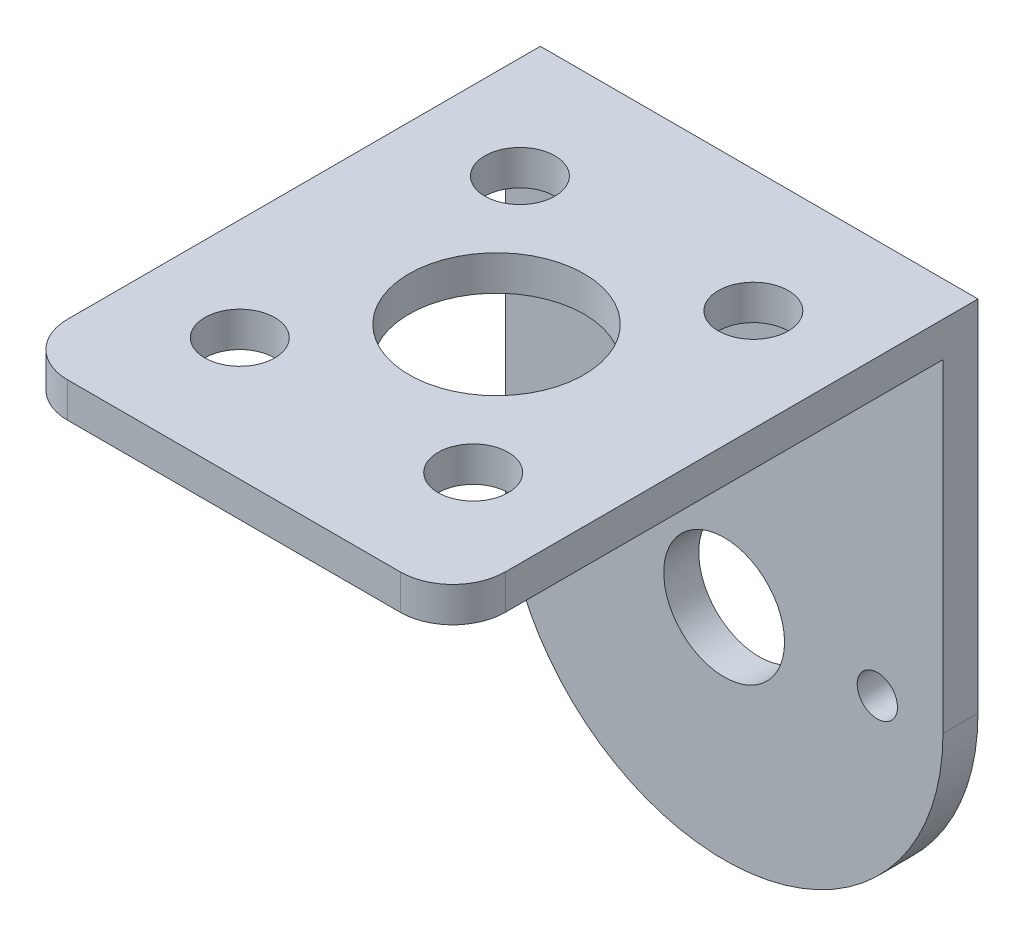
ISO-10303-21;
HEADER;
FILE_DESCRIPTION(('STEP AP214'),'2;1');
FILE_NAME('part.step','',(''),(''),'','','');
FILE_SCHEMA(('AUTOMOTIVE_DESIGN { 1 0 10303 214 1 1 1 1 }'));
ENDSEC;
DATA;
#1=APPLICATION_CONTEXT('core data for automotive mechanical design processes');
#2=APPLICATION_PROTOCOL_DEFINITION('international standard','automotive_design',2000,#1);
#3=PRODUCT_CONTEXT('',#1,'mechanical');
#4=PRODUCT('Part','Part','',(#3));
#5=PRODUCT_RELATED_PRODUCT_CATEGORY('part','',(#4));
#6=PRODUCT_DEFINITION_FORMATION('','',#4);
#7=PRODUCT_DEFINITION_CONTEXT('part definition',#1,'design');
#8=PRODUCT_DEFINITION('design','',#6,#7);
#9=PRODUCT_DEFINITION_SHAPE('','',#8);
#10=(LENGTH_UNIT() NAMED_UNIT(*) SI_UNIT(.MILLI.,.METRE.));
#11=(NAMED_UNIT(*) PLANE_ANGLE_UNIT() SI_UNIT($,.RADIAN.));
#12=(NAMED_UNIT(*) SI_UNIT($,.STERADIAN.) SOLID_ANGLE_UNIT());
#13=UNCERTAINTY_MEASURE_WITH_UNIT(LENGTH_MEASURE(1.E-05),#10,'distance_accuracy_value','');
#14=(GEOMETRIC_REPRESENTATION_CONTEXT(3) GLOBAL_UNCERTAINTY_ASSIGNED_CONTEXT((#13)) GLOBAL_UNIT_ASSIGNED_CONTEXT((#10,
#11,#12)) REPRESENTATION_CONTEXT('',''));
#15=CARTESIAN_POINT('',(0.,0.,0.));
#16=DIRECTION('',(0.,0.,1.));
#17=DIRECTION('',(1.,0.,0.));
#18=AXIS2_PLACEMENT_3D('',#15,#16,#17);
#19=CARTESIAN_POINT('',(-0.0431010072717737,-4.,2.));
#20=DIRECTION('',(0.,0.,1.));
#21=DIRECTION('',(1.,0.,0.));
#22=AXIS2_PLACEMENT_3D('',#19,#20,#21);
#23=PLANE('',#22);
#24=DIRECTION('',(1.,0.,0.));
#25=VECTOR('',#24,1.);
#26=CARTESIAN_POINT('',(-12.5431010072718,14.5,2.));
#27=LINE('',#26,#25);
#28=CARTESIAN_POINT('',(-12.5431010072718,14.5,2.));
#29=VERTEX_POINT('',#28);
#30=CARTESIAN_POINT('',(12.4568989927282,14.5,2.));
#31=VERTEX_POINT('',#30);
#32=EDGE_CURVE('E112',#29,#31,#27,.T.);
#33=ORIENTED_EDGE('',*,*,#32,.F.);
#34=DIRECTION('',(0.,-1.,0.));
#35=VECTOR('',#34,1.);
#36=CARTESIAN_POINT('',(-12.5431010072718,-4.,2.));
#37=LINE('',#36,#35);
#38=CARTESIAN_POINT('',(-12.5431010072718,-4.,2.));
#39=VERTEX_POINT('',#38);
#40=EDGE_CURVE('E150',#29,#39,#37,.T.);
#41=ORIENTED_EDGE('',*,*,#40,.T.);
#42=CARTESIAN_POINT('',(-0.0431010072717737,-4.,2.));
#43=DIRECTION('',(0.,0.,1.));
#44=DIRECTION('',(1.,0.,0.));
#45=AXIS2_PLACEMENT_3D('',#42,#43,#44);
#46=CIRCLE('',#45,12.5);
#47=CARTESIAN_POINT('',(12.4568989927282,-4.,2.));
#48=VERTEX_POINT('',#47);
#49=EDGE_CURVE('E115',#39,#48,#46,.T.);
#50=ORIENTED_EDGE('',*,*,#49,.T.);
#51=DIRECTION('',(0.,1.,0.));
#52=VECTOR('',#51,1.);
#53=CARTESIAN_POINT('',(12.4568989927282,-4.,2.));
#54=LINE('',#53,#52);
#55=EDGE_CURVE('E100',#48,#31,#54,.T.);
#56=ORIENTED_EDGE('',*,*,#55,.T.);
#57=EDGE_LOOP('',(#33,#41,#50,#56));
#58=FACE_BOUND('',#57,.T.);
#59=CARTESIAN_POINT('',(8.70689899272823,-4.,2.));
#60=DIRECTION('',(0.,0.,1.));
#61=DIRECTION('',(1.,0.,0.));
#62=AXIS2_PLACEMENT_3D('',#59,#60,#61);
#63=CIRCLE('',#62,1.15);
#64=CARTESIAN_POINT('',(9.85689899272823,-4.,2.));
#65=VERTEX_POINT('',#64);
#66=EDGE_CURVE('E138',#65,#65,#63,.T.);
#67=ORIENTED_EDGE('',*,*,#66,.F.);
#68=EDGE_LOOP('',(#67));
#69=FACE_BOUND('',#68,.T.);
#70=CARTESIAN_POINT('',(-0.0431010072717737,-4.,2.));
#71=DIRECTION('',(0.,0.,1.));
#72=DIRECTION('',(1.,0.,0.));
#73=AXIS2_PLACEMENT_3D('',#70,#71,#72);
#74=CIRCLE('',#73,3.45);
#75=CARTESIAN_POINT('',(3.40689899272823,-4.,2.));
#76=VERTEX_POINT('',#75);
#77=EDGE_CURVE('E144',#76,#76,#74,.T.);
#78=ORIENTED_EDGE('',*,*,#77,.F.);
#79=EDGE_LOOP('',(#78));
#80=FACE_BOUND('',#79,.T.);
#81=CARTESIAN_POINT('',(-8.79310100727177,-4.,2.));
#82=DIRECTION('',(0.,0.,1.));
#83=DIRECTION('',(1.,0.,0.));
#84=AXIS2_PLACEMENT_3D('',#81,#82,#83);
#85=CIRCLE('',#84,1.15);
#86=CARTESIAN_POINT('',(-7.64310100727177,-4.,2.));
#87=VERTEX_POINT('',#86);
#88=EDGE_CURVE('E132',#87,#87,#85,.T.);
#89=ORIENTED_EDGE('',*,*,#88,.F.);
#90=EDGE_LOOP('',(#89));
#91=FACE_BOUND('',#90,.T.);
#92=ADVANCED_FACE('F32',(#58,#69,#80,#91),#23,.T.);
#93=CARTESIAN_POINT('',(-0.0431010072717737,-4.,0.));
#94=DIRECTION('',(0.,0.,1.));
#95=DIRECTION('',(1.,0.,0.));
#96=AXIS2_PLACEMENT_3D('',#93,#94,#95);
#97=PLANE('',#96);
#98=DIRECTION('',(0.,-1.,0.));
#99=VECTOR('',#98,1.);
#100=CARTESIAN_POINT('',(-12.5431010072718,-4.,0.));
#101=LINE('',#100,#99);
#102=CARTESIAN_POINT('',(-12.5431010072718,16.5,0.));
#103=VERTEX_POINT('',#102);
#104=CARTESIAN_POINT('',(-12.5431010072718,-4.,0.));
#105=VERTEX_POINT('',#104);
#106=EDGE_CURVE('E147',#103,#105,#101,.T.);
#107=ORIENTED_EDGE('',*,*,#106,.F.);
#108=DIRECTION('',(-1.,0.,0.));
#109=VECTOR('',#108,1.);
#110=CARTESIAN_POINT('',(12.4568989927282,16.5,0.));
#111=LINE('',#110,#109);
#112=CARTESIAN_POINT('',(12.4568989927282,16.5,0.));
#113=VERTEX_POINT('',#112);
#114=EDGE_CURVE('E152',#113,#103,#111,.T.);
#115=ORIENTED_EDGE('',*,*,#114,.F.);
#116=DIRECTION('',(0.,1.,0.));
#117=VECTOR('',#116,1.);
#118=CARTESIAN_POINT('',(12.4568989927282,-4.,0.));
#119=LINE('',#118,#117);
#120=CARTESIAN_POINT('',(12.4568989927282,-4.,0.));
#121=VERTEX_POINT('',#120);
#122=EDGE_CURVE('E158',#121,#113,#119,.T.);
#123=ORIENTED_EDGE('',*,*,#122,.F.);
#124=CARTESIAN_POINT('',(-0.0431010072717737,-4.,0.));
#125=DIRECTION('',(0.,0.,1.));
#126=DIRECTION('',(1.,0.,0.));
#127=AXIS2_PLACEMENT_3D('',#124,#125,#126);
#128=CIRCLE('',#127,12.5);
#129=EDGE_CURVE('E156',#105,#121,#128,.T.);
#130=ORIENTED_EDGE('',*,*,#129,.F.);
#131=EDGE_LOOP('',(#107,#115,#123,#130));
#132=FACE_BOUND('',#131,.T.);
#133=CARTESIAN_POINT('',(-0.0431010072717737,-4.,0.));
#134=DIRECTION('',(0.,0.,1.));
#135=DIRECTION('',(1.,0.,0.));
#136=AXIS2_PLACEMENT_3D('',#133,#134,#135);
#137=CIRCLE('',#136,3.45);
#138=CARTESIAN_POINT('',(3.40689899272823,-4.,0.));
#139=VERTEX_POINT('',#138);
#140=EDGE_CURVE('E141',#139,#139,#137,.T.);
#141=ORIENTED_EDGE('',*,*,#140,.T.);
#142=EDGE_LOOP('',(#141));
#143=FACE_BOUND('',#142,.T.);
#144=CARTESIAN_POINT('',(8.70689899272823,-4.,0.));
#145=DIRECTION('',(0.,0.,1.));
#146=DIRECTION('',(1.,0.,0.));
#147=AXIS2_PLACEMENT_3D('',#144,#145,#146);
#148=CIRCLE('',#147,1.15);
#149=CARTESIAN_POINT('',(9.85689899272823,-4.,0.));
#150=VERTEX_POINT('',#149);
#151=EDGE_CURVE('E135',#150,#150,#148,.T.);
#152=ORIENTED_EDGE('',*,*,#151,.T.);
#153=EDGE_LOOP('',(#152));
#154=FACE_BOUND('',#153,.T.);
#155=CARTESIAN_POINT('',(-8.79310100727177,-4.,0.));
#156=DIRECTION('',(0.,0.,1.));
#157=DIRECTION('',(1.,0.,0.));
#158=AXIS2_PLACEMENT_3D('',#155,#156,#157);
#159=CIRCLE('',#158,1.15);
#160=CARTESIAN_POINT('',(-7.64310100727177,-4.,0.));
#161=VERTEX_POINT('',#160);
#162=EDGE_CURVE('E131',#161,#161,#159,.T.);
#163=ORIENTED_EDGE('',*,*,#162,.T.);
#164=EDGE_LOOP('',(#163));
#165=FACE_BOUND('',#164,.T.);
#166=ADVANCED_FACE('F199',(#132,#143,#154,#165),#97,.F.);
#167=CARTESIAN_POINT('',(-12.5431010072718,-4.,2.));
#168=DIRECTION('',(1.,0.,0.));
#169=DIRECTION('',(0.,0.,-1.));
#170=AXIS2_PLACEMENT_3D('',#167,#168,#169);
#171=PLANE('',#170);
#172=DIRECTION('',(0.,0.,-1.));
#173=VECTOR('',#172,1.);
#174=CARTESIAN_POINT('',(-12.5431010072718,14.5,30.));
#175=LINE('',#174,#173);
#176=CARTESIAN_POINT('',(-12.5431010072718,14.5,27.));
#177=VERTEX_POINT('',#176);
#178=EDGE_CURVE('E106',#177,#29,#175,.T.);
#179=ORIENTED_EDGE('',*,*,#178,.F.);
#180=DIRECTION('',(0.,-1.,0.));
#181=VECTOR('',#180,1.);
#182=CARTESIAN_POINT('',(-12.5431010072718,16.5,27.));
#183=LINE('',#182,#181);
#184=CARTESIAN_POINT('',(-12.5431010072718,16.5,27.));
#185=VERTEX_POINT('',#184);
#186=EDGE_CURVE('E40',#177,#185,#183,.F.);
#187=ORIENTED_EDGE('',*,*,#186,.T.);
#188=DIRECTION('',(0.,0.,-1.));
#189=VECTOR('',#188,1.);
#190=CARTESIAN_POINT('',(-12.5431010072718,16.5,2.));
#191=LINE('',#190,#189);
#192=EDGE_CURVE('E117',#185,#103,#191,.T.);
#193=ORIENTED_EDGE('',*,*,#192,.T.);
#194=ORIENTED_EDGE('',*,*,#106,.T.);
#195=DIRECTION('',(0.,0.,-1.));
#196=VECTOR('',#195,1.);
#197=CARTESIAN_POINT('',(-12.5431010072718,-4.,2.));
#198=LINE('',#197,#196);
#199=EDGE_CURVE('E168',#39,#105,#198,.T.);
#200=ORIENTED_EDGE('',*,*,#199,.F.);
#201=ORIENTED_EDGE('',*,*,#40,.F.);
#202=EDGE_LOOP('',(#179,#187,#193,#194,#200,#201));
#203=FACE_BOUND('',#202,.T.);
#204=ADVANCED_FACE('F204',(#203),#171,.F.);
#205=CARTESIAN_POINT('',(-0.0431010072717737,-4.,2.));
#206=DIRECTION('',(0.,0.,-1.));
#207=DIRECTION('',(-1.,0.,0.));
#208=AXIS2_PLACEMENT_3D('',#205,#206,#207);
#209=CYLINDRICAL_SURFACE('',#208,12.5);
#210=ORIENTED_EDGE('',*,*,#129,.T.);
#211=DIRECTION('',(0.,0.,-1.));
#212=VECTOR('',#211,1.);
#213=CARTESIAN_POINT('',(12.4568989927282,-4.,2.));
#214=LINE('',#213,#212);
#215=EDGE_CURVE('E166',#48,#121,#214,.T.);
#216=ORIENTED_EDGE('',*,*,#215,.F.);
#217=ORIENTED_EDGE('',*,*,#49,.F.);
#218=ORIENTED_EDGE('',*,*,#199,.T.);
#219=EDGE_LOOP('',(#210,#216,#217,#218));
#220=FACE_BOUND('',#219,.T.);
#221=ADVANCED_FACE('F216',(#220),#209,.T.);
#222=CARTESIAN_POINT('',(12.4568989927282,-4.,2.));
#223=DIRECTION('',(-1.,0.,0.));
#224=DIRECTION('',(0.,0.,1.));
#225=AXIS2_PLACEMENT_3D('',#222,#223,#224);
#226=PLANE('',#225);
#227=DIRECTION('',(0.,0.,-1.));
#228=VECTOR('',#227,1.);
#229=CARTESIAN_POINT('',(12.4568989927282,16.5,2.));
#230=LINE('',#229,#228);
#231=CARTESIAN_POINT('',(12.4568989927282,16.5,27.));
#232=VERTEX_POINT('',#231);
#233=EDGE_CURVE('E164',#232,#113,#230,.T.);
#234=ORIENTED_EDGE('',*,*,#233,.F.);
#235=DIRECTION('',(0.,1.,0.));
#236=VECTOR('',#235,1.);
#237=CARTESIAN_POINT('',(12.4568989927282,14.5,27.));
#238=LINE('',#237,#236);
#239=CARTESIAN_POINT('',(12.4568989927282,14.5,27.));
#240=VERTEX_POINT('',#239);
#241=EDGE_CURVE('E102',#232,#240,#238,.F.);
#242=ORIENTED_EDGE('',*,*,#241,.T.);
#243=DIRECTION('',(0.,0.,-1.));
#244=VECTOR('',#243,1.);
#245=CARTESIAN_POINT('',(12.4568989927282,14.5,30.));
#246=LINE('',#245,#244);
#247=EDGE_CURVE('E95',#240,#31,#246,.T.);
#248=ORIENTED_EDGE('',*,*,#247,.T.);
#249=ORIENTED_EDGE('',*,*,#55,.F.);
#250=ORIENTED_EDGE('',*,*,#215,.T.);
#251=ORIENTED_EDGE('',*,*,#122,.T.);
#252=EDGE_LOOP('',(#234,#242,#248,#249,#250,#251));
#253=FACE_BOUND('',#252,.T.);
#254=ADVANCED_FACE('F98',(#253),#226,.F.);
#255=CARTESIAN_POINT('',(12.4568989927282,16.5,2.));
#256=DIRECTION('',(0.,-1.,0.));
#257=DIRECTION('',(1.,0.,0.));
#258=AXIS2_PLACEMENT_3D('',#255,#256,#257);
#259=PLANE('',#258);
#260=CARTESIAN_POINT('',(-6.70976767393844,16.5,23.));
#261=DIRECTION('',(0.,-1.,0.));
#262=DIRECTION('',(0.,0.,1.));
#263=AXIS2_PLACEMENT_3D('',#260,#261,#262);
#264=CIRCLE('',#263,2.);
#265=CARTESIAN_POINT('',(-6.70976767393844,16.5,25.));
#266=VERTEX_POINT('',#265);
#267=EDGE_CURVE('E292',#266,#266,#264,.T.);
#268=ORIENTED_EDGE('',*,*,#267,.T.);
#269=EDGE_LOOP('',(#268));
#270=FACE_BOUND('',#269,.T.);
#271=CARTESIAN_POINT('',(6.62356565939489,16.5,23.));
#272=DIRECTION('',(0.,-1.,0.));
#273=DIRECTION('',(0.,0.,-1.));
#274=AXIS2_PLACEMENT_3D('',#271,#272,#273);
#275=CIRCLE('',#274,2.);
#276=CARTESIAN_POINT('',(6.62356565939489,16.5,21.));
#277=VERTEX_POINT('',#276);
#278=EDGE_CURVE('E286',#277,#277,#275,.T.);
#279=ORIENTED_EDGE('',*,*,#278,.T.);
#280=EDGE_LOOP('',(#279));
#281=FACE_BOUND('',#280,.T.);
#282=CARTESIAN_POINT('',(6.62356565939489,16.5,7.));
#283=DIRECTION('',(0.,-1.,0.));
#284=DIRECTION('',(0.,0.,1.));
#285=AXIS2_PLACEMENT_3D('',#282,#283,#284);
#286=CIRCLE('',#285,2.);
#287=CARTESIAN_POINT('',(6.62356565939489,16.5,9.));
#288=VERTEX_POINT('',#287);
#289=EDGE_CURVE('E277',#288,#288,#286,.T.);
#290=ORIENTED_EDGE('',*,*,#289,.T.);
#291=EDGE_LOOP('',(#290));
#292=FACE_BOUND('',#291,.T.);
#293=CARTESIAN_POINT('',(-6.70976767393844,16.5,7.));
#294=DIRECTION('',(0.,-1.,0.));
#295=DIRECTION('',(0.,0.,-1.));
#296=AXIS2_PLACEMENT_3D('',#293,#294,#295);
#297=CIRCLE('',#296,2.);
#298=CARTESIAN_POINT('',(-6.70976767393844,16.5,5.));
#299=VERTEX_POINT('',#298);
#300=EDGE_CURVE('E272',#299,#299,#297,.T.);
#301=ORIENTED_EDGE('',*,*,#300,.T.);
#302=EDGE_LOOP('',(#301));
#303=FACE_BOUND('',#302,.T.);
#304=CARTESIAN_POINT('',(-0.0431010072717735,16.5,15.));
#305=DIRECTION('',(0.,-1.,0.));
#306=DIRECTION('',(0.,0.,-1.));
#307=AXIS2_PLACEMENT_3D('',#304,#305,#306);
#308=CIRCLE('',#307,5.);
#309=CARTESIAN_POINT('',(-0.0431010072717735,16.5,10.));
#310=VERTEX_POINT('',#309);
#311=EDGE_CURVE('E121',#310,#310,#308,.T.);
#312=ORIENTED_EDGE('',*,*,#311,.T.);
#313=EDGE_LOOP('',(#312));
#314=FACE_BOUND('',#313,.T.);
#315=ORIENTED_EDGE('',*,*,#192,.F.);
#316=CARTESIAN_POINT('',(-9.54310100727177,16.5,27.));
#317=DIRECTION('',(0.,-1.,0.));
#318=DIRECTION('',(1.,0.,0.));
#319=AXIS2_PLACEMENT_3D('',#316,#317,#318);
#320=CIRCLE('',#319,3.);
#321=CARTESIAN_POINT('',(-9.54310100727177,16.5,30.));
#322=VERTEX_POINT('',#321);
#323=EDGE_CURVE('E11',#185,#322,#320,.F.);
#324=ORIENTED_EDGE('',*,*,#323,.T.);
#325=DIRECTION('',(-1.,0.,0.));
#326=VECTOR('',#325,1.);
#327=CARTESIAN_POINT('',(-12.5431010072718,16.5,30.));
#328=LINE('',#327,#326);
#329=CARTESIAN_POINT('',(9.45689899272822,16.5,30.));
#330=VERTEX_POINT('',#329);
#331=EDGE_CURVE('E120',#330,#322,#328,.T.);
#332=ORIENTED_EDGE('',*,*,#331,.F.);
#333=CARTESIAN_POINT('',(9.45689899272823,16.5,27.));
#334=DIRECTION('',(0.,-1.,0.));
#335=DIRECTION('',(1.,0.,0.));
#336=AXIS2_PLACEMENT_3D('',#333,#334,#335);
#337=CIRCLE('',#336,3.);
#338=EDGE_CURVE('E174',#330,#232,#337,.F.);
#339=ORIENTED_EDGE('',*,*,#338,.T.);
#340=ORIENTED_EDGE('',*,*,#233,.T.);
#341=ORIENTED_EDGE('',*,*,#114,.T.);
#342=EDGE_LOOP('',(#315,#324,#332,#339,#340,#341));
#343=FACE_BOUND('',#342,.T.);
#344=ADVANCED_FACE('F192',(#270,#281,#292,#303,#314,#343),#259,.F.);
#345=CARTESIAN_POINT('',(-0.0431010072717737,-4.,2.));
#346=DIRECTION('',(0.,0.,-1.));
#347=DIRECTION('',(-1.,0.,0.));
#348=AXIS2_PLACEMENT_3D('',#345,#346,#347);
#349=CYLINDRICAL_SURFACE('',#348,3.45);
#350=ORIENTED_EDGE('',*,*,#77,.T.);
#351=EDGE_LOOP('',(#350));
#352=FACE_BOUND('',#351,.T.);
#353=ORIENTED_EDGE('',*,*,#140,.F.);
#354=EDGE_LOOP('',(#353));
#355=FACE_BOUND('',#354,.T.);
#356=ADVANCED_FACE('F208',(#352,#355),#349,.F.);
#357=CARTESIAN_POINT('',(8.70689899272823,-4.,2.));
#358=DIRECTION('',(0.,0.,-1.));
#359=DIRECTION('',(-1.,0.,0.));
#360=AXIS2_PLACEMENT_3D('',#357,#358,#359);
#361=CYLINDRICAL_SURFACE('',#360,1.15);
#362=ORIENTED_EDGE('',*,*,#66,.T.);
#363=EDGE_LOOP('',(#362));
#364=FACE_BOUND('',#363,.T.);
#365=ORIENTED_EDGE('',*,*,#151,.F.);
#366=EDGE_LOOP('',(#365));
#367=FACE_BOUND('',#366,.T.);
#368=ADVANCED_FACE('F236',(#364,#367),#361,.F.);
#369=CARTESIAN_POINT('',(-8.79310100727177,-4.,2.));
#370=DIRECTION('',(0.,0.,-1.));
#371=DIRECTION('',(-1.,0.,0.));
#372=AXIS2_PLACEMENT_3D('',#369,#370,#371);
#373=CYLINDRICAL_SURFACE('',#372,1.15);
#374=ORIENTED_EDGE('',*,*,#88,.T.);
#375=EDGE_LOOP('',(#374));
#376=FACE_BOUND('',#375,.T.);
#377=ORIENTED_EDGE('',*,*,#162,.F.);
#378=EDGE_LOOP('',(#377));
#379=FACE_BOUND('',#378,.T.);
#380=ADVANCED_FACE('F234',(#376,#379),#373,.F.);
#381=CARTESIAN_POINT('',(-12.5431010072718,14.5,30.));
#382=DIRECTION('',(0.,1.,0.));
#383=DIRECTION('',(0.,0.,1.));
#384=AXIS2_PLACEMENT_3D('',#381,#382,#383);
#385=PLANE('',#384);
#386=CARTESIAN_POINT('',(-6.70976767393844,14.5,23.));
#387=DIRECTION('',(0.,-1.,0.));
#388=DIRECTION('',(0.,0.,1.));
#389=AXIS2_PLACEMENT_3D('',#386,#387,#388);
#390=CIRCLE('',#389,2.);
#391=CARTESIAN_POINT('',(-6.70976767393844,14.5,25.));
#392=VERTEX_POINT('',#391);
#393=EDGE_CURVE('E295',#392,#392,#390,.T.);
#394=ORIENTED_EDGE('',*,*,#393,.F.);
#395=EDGE_LOOP('',(#394));
#396=FACE_BOUND('',#395,.T.);
#397=CARTESIAN_POINT('',(6.62356565939489,14.5,23.));
#398=DIRECTION('',(0.,-1.,0.));
#399=DIRECTION('',(0.,0.,-1.));
#400=AXIS2_PLACEMENT_3D('',#397,#398,#399);
#401=CIRCLE('',#400,2.);
#402=CARTESIAN_POINT('',(6.62356565939489,14.5,21.));
#403=VERTEX_POINT('',#402);
#404=EDGE_CURVE('E289',#403,#403,#401,.T.);
#405=ORIENTED_EDGE('',*,*,#404,.F.);
#406=EDGE_LOOP('',(#405));
#407=FACE_BOUND('',#406,.T.);
#408=CARTESIAN_POINT('',(6.62356565939489,14.5,7.));
#409=DIRECTION('',(0.,-1.,0.));
#410=DIRECTION('',(0.,0.,1.));
#411=AXIS2_PLACEMENT_3D('',#408,#409,#410);
#412=CIRCLE('',#411,2.);
#413=CARTESIAN_POINT('',(6.62356565939489,14.5,9.));
#414=VERTEX_POINT('',#413);
#415=EDGE_CURVE('E281',#414,#414,#412,.T.);
#416=ORIENTED_EDGE('',*,*,#415,.F.);
#417=EDGE_LOOP('',(#416));
#418=FACE_BOUND('',#417,.T.);
#419=CARTESIAN_POINT('',(-6.70976767393844,14.5,7.));
#420=DIRECTION('',(0.,-1.,0.));
#421=DIRECTION('',(0.,0.,-1.));
#422=AXIS2_PLACEMENT_3D('',#419,#420,#421);
#423=CIRCLE('',#422,2.);
#424=CARTESIAN_POINT('',(-6.70976767393844,14.5,5.));
#425=VERTEX_POINT('',#424);
#426=EDGE_CURVE('E275',#425,#425,#423,.T.);
#427=ORIENTED_EDGE('',*,*,#426,.F.);
#428=EDGE_LOOP('',(#427));
#429=FACE_BOUND('',#428,.T.);
#430=CARTESIAN_POINT('',(-0.0431010072717735,14.5,15.));
#431=DIRECTION('',(0.,-1.,0.));
#432=DIRECTION('',(0.,0.,-1.));
#433=AXIS2_PLACEMENT_3D('',#430,#431,#432);
#434=CIRCLE('',#433,5.);
#435=CARTESIAN_POINT('',(-0.0431010072717735,14.5,10.));
#436=VERTEX_POINT('',#435);
#437=EDGE_CURVE('E126',#436,#436,#434,.T.);
#438=ORIENTED_EDGE('',*,*,#437,.F.);
#439=EDGE_LOOP('',(#438));
#440=FACE_BOUND('',#439,.T.);
#441=DIRECTION('',(1.,0.,0.));
#442=VECTOR('',#441,1.);
#443=CARTESIAN_POINT('',(-12.5431010072718,14.5,30.));
#444=LINE('',#443,#442);
#445=CARTESIAN_POINT('',(-9.54310100727177,14.5,30.));
#446=VERTEX_POINT('',#445);
#447=CARTESIAN_POINT('',(9.45689899272822,14.5,30.));
#448=VERTEX_POINT('',#447);
#449=EDGE_CURVE('E107',#446,#448,#444,.T.);
#450=ORIENTED_EDGE('',*,*,#449,.F.);
#451=CARTESIAN_POINT('',(-9.54310100727177,14.5,27.));
#452=DIRECTION('',(0.,1.,0.));
#453=DIRECTION('',(0.,0.,1.));
#454=AXIS2_PLACEMENT_3D('',#451,#452,#453);
#455=CIRCLE('',#454,3.);
#456=EDGE_CURVE('E54',#446,#177,#455,.F.);
#457=ORIENTED_EDGE('',*,*,#456,.T.);
#458=ORIENTED_EDGE('',*,*,#178,.T.);
#459=ORIENTED_EDGE('',*,*,#32,.T.);
#460=ORIENTED_EDGE('',*,*,#247,.F.);
#461=CARTESIAN_POINT('',(9.45689899272823,14.5,27.));
#462=DIRECTION('',(0.,1.,0.));
#463=DIRECTION('',(0.,0.,1.));
#464=AXIS2_PLACEMENT_3D('',#461,#462,#463);
#465=CIRCLE('',#464,3.);
#466=EDGE_CURVE('E177',#240,#448,#465,.F.);
#467=ORIENTED_EDGE('',*,*,#466,.T.);
#468=EDGE_LOOP('',(#450,#457,#458,#459,#460,#467));
#469=FACE_BOUND('',#468,.T.);
#470=ADVANCED_FACE('F119',(#396,#407,#418,#429,#440,#469),#385,.F.);
#471=CARTESIAN_POINT('',(0.,0.,30.));
#472=DIRECTION('',(0.,0.,1.));
#473=DIRECTION('',(1.,0.,0.));
#474=AXIS2_PLACEMENT_3D('',#471,#472,#473);
#475=PLANE('',#474);
#476=ORIENTED_EDGE('',*,*,#331,.T.);
#477=DIRECTION('',(0.,-1.,0.));
#478=VECTOR('',#477,1.);
#479=CARTESIAN_POINT('',(-9.54310100727177,14.5,30.));
#480=LINE('',#479,#478);
#481=EDGE_CURVE('E179',#322,#446,#480,.T.);
#482=ORIENTED_EDGE('',*,*,#481,.T.);
#483=ORIENTED_EDGE('',*,*,#449,.T.);
#484=DIRECTION('',(0.,1.,0.));
#485=VECTOR('',#484,1.);
#486=CARTESIAN_POINT('',(9.45689899272823,16.5,30.));
#487=LINE('',#486,#485);
#488=EDGE_CURVE('E171',#448,#330,#487,.T.);
#489=ORIENTED_EDGE('',*,*,#488,.T.);
#490=EDGE_LOOP('',(#476,#482,#483,#489));
#491=FACE_BOUND('',#490,.T.);
#492=ADVANCED_FACE('F184',(#491),#475,.T.);
#493=CARTESIAN_POINT('',(-0.0431010072717735,16.5,15.));
#494=DIRECTION('',(0.,-1.,0.));
#495=DIRECTION('',(0.,0.,-1.));
#496=AXIS2_PLACEMENT_3D('',#493,#494,#495);
#497=CYLINDRICAL_SURFACE('',#496,5.);
#498=ORIENTED_EDGE('',*,*,#311,.F.);
#499=EDGE_LOOP('',(#498));
#500=FACE_BOUND('',#499,.T.);
#501=ORIENTED_EDGE('',*,*,#437,.T.);
#502=EDGE_LOOP('',(#501));
#503=FACE_BOUND('',#502,.T.);
#504=ADVANCED_FACE('F249',(#500,#503),#497,.F.);
#505=CARTESIAN_POINT('',(-6.70976767393844,16.5,7.));
#506=DIRECTION('',(0.,-1.,0.));
#507=DIRECTION('',(0.,0.,-1.));
#508=AXIS2_PLACEMENT_3D('',#505,#506,#507);
#509=CYLINDRICAL_SURFACE('',#508,2.);
#510=ORIENTED_EDGE('',*,*,#300,.F.);
#511=EDGE_LOOP('',(#510));
#512=FACE_BOUND('',#511,.T.);
#513=ORIENTED_EDGE('',*,*,#426,.T.);
#514=EDGE_LOOP('',(#513));
#515=FACE_BOUND('',#514,.T.);
#516=ADVANCED_FACE('F252',(#512,#515),#509,.F.);
#517=CARTESIAN_POINT('',(6.62356565939489,16.5,7.));
#518=DIRECTION('',(0.,-1.,0.));
#519=DIRECTION('',(0.,0.,-1.));
#520=AXIS2_PLACEMENT_3D('',#517,#518,#519);
#521=CYLINDRICAL_SURFACE('',#520,2.);
#522=ORIENTED_EDGE('',*,*,#289,.F.);
#523=EDGE_LOOP('',(#522));
#524=FACE_BOUND('',#523,.T.);
#525=ORIENTED_EDGE('',*,*,#415,.T.);
#526=EDGE_LOOP('',(#525));
#527=FACE_BOUND('',#526,.T.);
#528=ADVANCED_FACE('F260',(#524,#527),#521,.F.);
#529=CARTESIAN_POINT('',(6.62356565939489,16.5,23.));
#530=DIRECTION('',(0.,-1.,0.));
#531=DIRECTION('',(0.,0.,-1.));
#532=AXIS2_PLACEMENT_3D('',#529,#530,#531);
#533=CYLINDRICAL_SURFACE('',#532,2.);
#534=ORIENTED_EDGE('',*,*,#278,.F.);
#535=EDGE_LOOP('',(#534));
#536=FACE_BOUND('',#535,.T.);
#537=ORIENTED_EDGE('',*,*,#404,.T.);
#538=EDGE_LOOP('',(#537));
#539=FACE_BOUND('',#538,.T.);
#540=ADVANCED_FACE('F256',(#536,#539),#533,.F.);
#541=CARTESIAN_POINT('',(-6.70976767393844,16.5,23.));
#542=DIRECTION('',(0.,-1.,0.));
#543=DIRECTION('',(0.,0.,-1.));
#544=AXIS2_PLACEMENT_3D('',#541,#542,#543);
#545=CYLINDRICAL_SURFACE('',#544,2.);
#546=ORIENTED_EDGE('',*,*,#267,.F.);
#547=EDGE_LOOP('',(#546));
#548=FACE_BOUND('',#547,.T.);
#549=ORIENTED_EDGE('',*,*,#393,.T.);
#550=EDGE_LOOP('',(#549));
#551=FACE_BOUND('',#550,.T.);
#552=ADVANCED_FACE('F197',(#548,#551),#545,.F.);
#553=CARTESIAN_POINT('',(9.45689899272823,0.,27.));
#554=DIRECTION('',(0.,-1.,0.));
#555=DIRECTION('',(0.,0.,-1.));
#556=AXIS2_PLACEMENT_3D('',#553,#554,#555);
#557=CYLINDRICAL_SURFACE('',#556,3.);
#558=ORIENTED_EDGE('',*,*,#466,.F.);
#559=ORIENTED_EDGE('',*,*,#241,.F.);
#560=ORIENTED_EDGE('',*,*,#338,.F.);
#561=ORIENTED_EDGE('',*,*,#488,.F.);
#562=EDGE_LOOP('',(#558,#559,#560,#561));
#563=FACE_BOUND('',#562,.T.);
#564=ADVANCED_FACE('F190',(#563),#557,.T.);
#565=CARTESIAN_POINT('',(-9.54310100727177,0.,27.));
#566=DIRECTION('',(0.,1.,0.));
#567=DIRECTION('',(0.,0.,1.));
#568=AXIS2_PLACEMENT_3D('',#565,#566,#567);
#569=CYLINDRICAL_SURFACE('',#568,3.);
#570=ORIENTED_EDGE('',*,*,#323,.F.);
#571=ORIENTED_EDGE('',*,*,#186,.F.);
#572=ORIENTED_EDGE('',*,*,#456,.F.);
#573=ORIENTED_EDGE('',*,*,#481,.F.);
#574=EDGE_LOOP('',(#570,#571,#572,#573));
#575=FACE_BOUND('',#574,.T.);
#576=ADVANCED_FACE('F34',(#575),#569,.T.);
#577=CLOSED_SHELL('',(#92,#166,#204,#221,#254,#344,#356,#368,#380,#470,#492,#504,#516,#528,#540,
#552,#564,#576));
#578=MANIFOLD_SOLID_BREP('B2',#577);
#579=ADVANCED_BREP_SHAPE_REPRESENTATION('',(#18,#578),#14);
#580=SHAPE_DEFINITION_REPRESENTATION(#9,#579);
ENDSEC;
END-ISO-10303-21;
